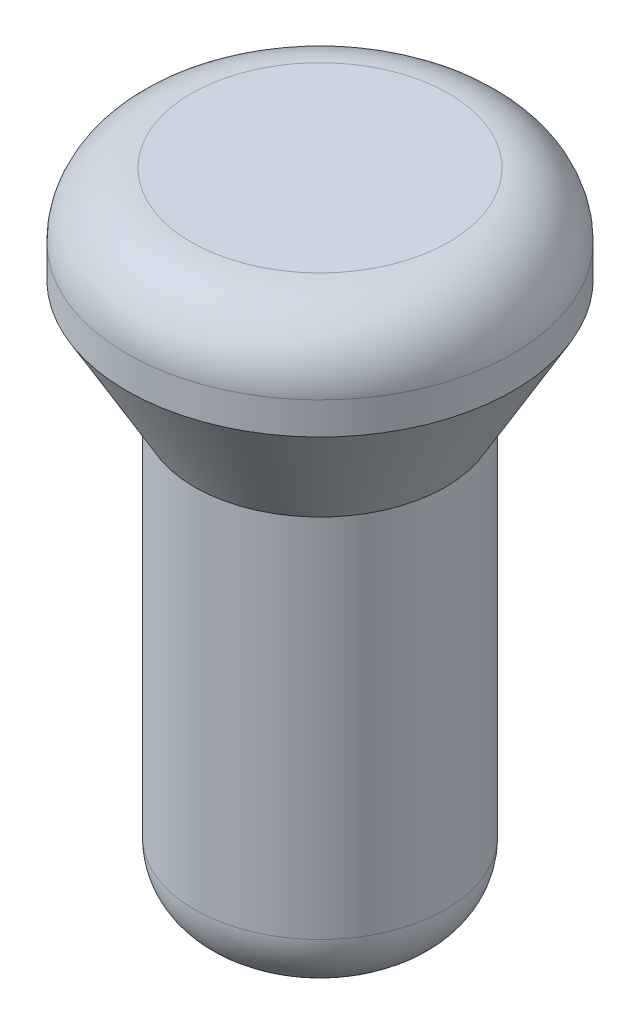
ISO-10303-21;
HEADER;
FILE_DESCRIPTION(('STEP AP214'),'2;1');
FILE_NAME('part.step','',(''),(''),'','','');
FILE_SCHEMA(('AUTOMOTIVE_DESIGN { 1 0 10303 214 1 1 1 1 }'));
ENDSEC;
DATA;
#1=APPLICATION_CONTEXT('core data for automotive mechanical design processes');
#2=APPLICATION_PROTOCOL_DEFINITION('international standard','automotive_design',2000,#1);
#3=PRODUCT_CONTEXT('',#1,'mechanical');
#4=PRODUCT('Part','Part','',(#3));
#5=PRODUCT_RELATED_PRODUCT_CATEGORY('part','',(#4));
#6=PRODUCT_DEFINITION_FORMATION('','',#4);
#7=PRODUCT_DEFINITION_CONTEXT('part definition',#1,'design');
#8=PRODUCT_DEFINITION('design','',#6,#7);
#9=PRODUCT_DEFINITION_SHAPE('','',#8);
#10=(LENGTH_UNIT() NAMED_UNIT(*) SI_UNIT(.MILLI.,.METRE.));
#11=(NAMED_UNIT(*) PLANE_ANGLE_UNIT() SI_UNIT($,.RADIAN.));
#12=(NAMED_UNIT(*) SI_UNIT($,.STERADIAN.) SOLID_ANGLE_UNIT());
#13=UNCERTAINTY_MEASURE_WITH_UNIT(LENGTH_MEASURE(1.E-05),#10,'distance_accuracy_value','');
#14=(GEOMETRIC_REPRESENTATION_CONTEXT(3) GLOBAL_UNCERTAINTY_ASSIGNED_CONTEXT((#13)) GLOBAL_UNIT_ASSIGNED_CONTEXT((#10,
#11,#12)) REPRESENTATION_CONTEXT('',''));
#15=CARTESIAN_POINT('',(0.,0.,0.));
#16=DIRECTION('',(0.,0.,1.));
#17=DIRECTION('',(1.,0.,0.));
#18=AXIS2_PLACEMENT_3D('',#15,#16,#17);
#19=CARTESIAN_POINT('',(0.,-4.5,0.));
#20=DIRECTION('',(0.,1.,0.));
#21=DIRECTION('',(0.,0.,1.));
#22=AXIS2_PLACEMENT_3D('',#19,#20,#21);
#23=PLANE('',#22);
#24=CARTESIAN_POINT('',(0.,-4.5,0.));
#25=DIRECTION('',(0.,-1.,0.));
#26=DIRECTION('',(0.,0.,-1.));
#27=AXIS2_PLACEMENT_3D('',#24,#25,#26);
#28=CIRCLE('',#27,0.95);
#29=CARTESIAN_POINT('',(0.,-4.5,-0.95));
#30=VERTEX_POINT('',#29);
#31=EDGE_CURVE('E10',#30,#30,#28,.T.);
#32=ORIENTED_EDGE('',*,*,#31,.T.);
#33=EDGE_LOOP('',(#32));
#34=FACE_BOUND('',#33,.T.);
#35=ADVANCED_FACE('F31',(#34),#23,.F.);
#36=CARTESIAN_POINT('',(0.,-3.5,0.));
#37=DIRECTION('',(0.,-1.,0.));
#38=DIRECTION('',(0.,0.,-1.));
#39=AXIS2_PLACEMENT_3D('',#36,#37,#38);
#40=DEGENERATE_TOROIDAL_SURFACE('',#39,0.95,1.,.T.);
#41=ORIENTED_EDGE('',*,*,#31,.F.);
#42=EDGE_LOOP('',(#41));
#43=FACE_BOUND('',#42,.T.);
#44=CARTESIAN_POINT('',(0.,-3.5,0.));
#45=DIRECTION('',(0.,-1.,0.));
#46=DIRECTION('',(0.,0.,-1.));
#47=AXIS2_PLACEMENT_3D('',#44,#45,#46);
#48=CIRCLE('',#47,1.95);
#49=CARTESIAN_POINT('',(0.,-3.5,-1.95));
#50=VERTEX_POINT('',#49);
#51=EDGE_CURVE('E37',#50,#50,#48,.T.);
#52=ORIENTED_EDGE('',*,*,#51,.T.);
#53=EDGE_LOOP('',(#52));
#54=FACE_BOUND('',#53,.T.);
#55=ADVANCED_FACE('F69',(#43,#54),#40,.T.);
#56=CARTESIAN_POINT('',(0.,0.,0.));
#57=DIRECTION('',(0.,-1.,0.));
#58=DIRECTION('',(0.,0.,-1.));
#59=AXIS2_PLACEMENT_3D('',#56,#57,#58);
#60=CYLINDRICAL_SURFACE('',#59,1.95);
#61=ORIENTED_EDGE('',*,*,#51,.F.);
#62=EDGE_LOOP('',(#61));
#63=FACE_BOUND('',#62,.T.);
#64=CARTESIAN_POINT('',(0.,2.18134665205265,0.));
#65=DIRECTION('',(0.,-1.,0.));
#66=DIRECTION('',(0.,0.,-1.));
#67=AXIS2_PLACEMENT_3D('',#64,#65,#66);
#68=CIRCLE('',#67,1.95);
#69=CARTESIAN_POINT('',(0.,2.18134665205265,-1.95));
#70=VERTEX_POINT('',#69);
#71=EDGE_CURVE('E41',#70,#70,#68,.T.);
#72=ORIENTED_EDGE('',*,*,#71,.T.);
#73=EDGE_LOOP('',(#72));
#74=FACE_BOUND('',#73,.T.);
#75=ADVANCED_FACE('F73',(#63,#74),#60,.T.);
#76=CARTESIAN_POINT('',(0.,4.,0.));
#77=DIRECTION('',(0.,1.,0.));
#78=DIRECTION('',(0.,0.,1.));
#79=AXIS2_PLACEMENT_3D('',#76,#77,#78);
#80=CONICAL_SURFACE('',#79,3.,0.523598775598293);
#81=ORIENTED_EDGE('',*,*,#71,.F.);
#82=EDGE_LOOP('',(#81));
#83=FACE_BOUND('',#82,.T.);
#84=CARTESIAN_POINT('',(0.,4.,0.));
#85=DIRECTION('',(0.,-1.,0.));
#86=DIRECTION('',(0.,0.,-1.));
#87=AXIS2_PLACEMENT_3D('',#84,#85,#86);
#88=CIRCLE('',#87,3.);
#89=CARTESIAN_POINT('',(0.,4.,-3.));
#90=VERTEX_POINT('',#89);
#91=EDGE_CURVE('E45',#90,#90,#88,.T.);
#92=ORIENTED_EDGE('',*,*,#91,.T.);
#93=EDGE_LOOP('',(#92));
#94=FACE_BOUND('',#93,.T.);
#95=ADVANCED_FACE('F78',(#83,#94),#80,.T.);
#96=CARTESIAN_POINT('',(0.,0.,0.));
#97=DIRECTION('',(0.,-1.,0.));
#98=DIRECTION('',(0.,0.,-1.));
#99=AXIS2_PLACEMENT_3D('',#96,#97,#98);
#100=CYLINDRICAL_SURFACE('',#99,3.);
#101=ORIENTED_EDGE('',*,*,#91,.F.);
#102=EDGE_LOOP('',(#101));
#103=FACE_BOUND('',#102,.T.);
#104=CARTESIAN_POINT('',(0.,4.5,0.));
#105=DIRECTION('',(0.,-1.,0.));
#106=DIRECTION('',(0.,0.,-1.));
#107=AXIS2_PLACEMENT_3D('',#104,#105,#106);
#108=CIRCLE('',#107,3.);
#109=CARTESIAN_POINT('',(0.,4.5,-3.));
#110=VERTEX_POINT('',#109);
#111=EDGE_CURVE('E50',#110,#110,#108,.T.);
#112=ORIENTED_EDGE('',*,*,#111,.T.);
#113=EDGE_LOOP('',(#112));
#114=FACE_BOUND('',#113,.T.);
#115=ADVANCED_FACE('F65',(#103,#114),#100,.T.);
#116=CARTESIAN_POINT('',(0.,4.5,0.));
#117=DIRECTION('',(0.,-1.,0.));
#118=DIRECTION('',(0.,0.,-1.));
#119=AXIS2_PLACEMENT_3D('',#116,#117,#118);
#120=TOROIDAL_SURFACE('',#119,2.,0.999999999999999);
#121=ORIENTED_EDGE('',*,*,#111,.F.);
#122=EDGE_LOOP('',(#121));
#123=FACE_BOUND('',#122,.T.);
#124=CARTESIAN_POINT('',(0.,5.5,0.));
#125=DIRECTION('',(0.,-1.,0.));
#126=DIRECTION('',(0.,0.,-1.));
#127=AXIS2_PLACEMENT_3D('',#124,#125,#126);
#128=CIRCLE('',#127,2.);
#129=CARTESIAN_POINT('',(0.,5.5,-2.));
#130=VERTEX_POINT('',#129);
#131=EDGE_CURVE('E53',#130,#130,#128,.T.);
#132=ORIENTED_EDGE('',*,*,#131,.T.);
#133=EDGE_LOOP('',(#132));
#134=FACE_BOUND('',#133,.T.);
#135=ADVANCED_FACE('F57',(#123,#134),#120,.T.);
#136=CARTESIAN_POINT('',(0.,5.5,2.));
#137=DIRECTION('',(0.,-1.,0.));
#138=DIRECTION('',(0.,0.,-1.));
#139=AXIS2_PLACEMENT_3D('',#136,#137,#138);
#140=PLANE('',#139);
#141=ORIENTED_EDGE('',*,*,#131,.F.);
#142=EDGE_LOOP('',(#141));
#143=FACE_BOUND('',#142,.T.);
#144=ADVANCED_FACE('F59',(#143),#140,.F.);
#145=CLOSED_SHELL('',(#35,#55,#75,#95,#115,#135,#144));
#146=MANIFOLD_SOLID_BREP('B2',#145);
#147=ADVANCED_BREP_SHAPE_REPRESENTATION('',(#18,#146),#14);
#148=SHAPE_DEFINITION_REPRESENTATION(#9,#147);
ENDSEC;
END-ISO-10303-21;
